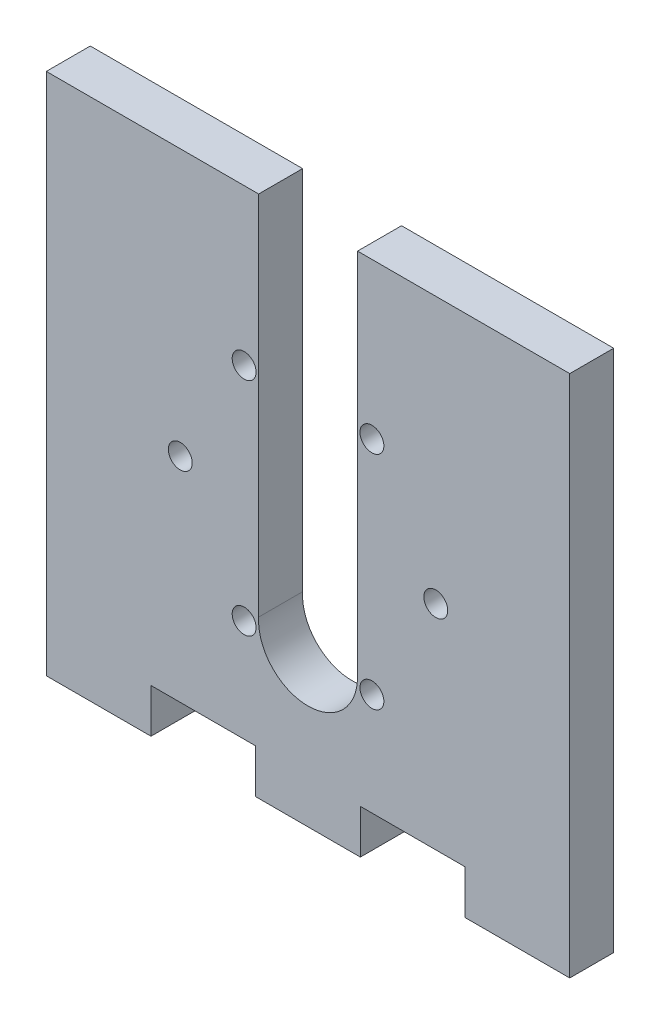
ISO-10303-21;
HEADER;
FILE_DESCRIPTION(('STEP AP214'),'2;1');
FILE_NAME('part.step','',(''),(''),'','','');
FILE_SCHEMA(('AUTOMOTIVE_DESIGN { 1 0 10303 214 1 1 1 1 }'));
ENDSEC;
DATA;
#1=APPLICATION_CONTEXT('core data for automotive mechanical design processes');
#2=APPLICATION_PROTOCOL_DEFINITION('international standard','automotive_design',2000,#1);
#3=PRODUCT_CONTEXT('',#1,'mechanical');
#4=PRODUCT('Part','Part','',(#3));
#5=PRODUCT_RELATED_PRODUCT_CATEGORY('part','',(#4));
#6=PRODUCT_DEFINITION_FORMATION('','',#4);
#7=PRODUCT_DEFINITION_CONTEXT('part definition',#1,'design');
#8=PRODUCT_DEFINITION('design','',#6,#7);
#9=PRODUCT_DEFINITION_SHAPE('','',#8);
#10=(LENGTH_UNIT() NAMED_UNIT(*) SI_UNIT(.MILLI.,.METRE.));
#11=(NAMED_UNIT(*) PLANE_ANGLE_UNIT() SI_UNIT($,.RADIAN.));
#12=(NAMED_UNIT(*) SI_UNIT($,.STERADIAN.) SOLID_ANGLE_UNIT());
#13=UNCERTAINTY_MEASURE_WITH_UNIT(LENGTH_MEASURE(1.E-05),#10,'distance_accuracy_value','');
#14=(GEOMETRIC_REPRESENTATION_CONTEXT(3) GLOBAL_UNCERTAINTY_ASSIGNED_CONTEXT((#13)) GLOBAL_UNIT_ASSIGNED_CONTEXT((#10,
#11,#12)) REPRESENTATION_CONTEXT('',''));
#15=CARTESIAN_POINT('',(0.,0.,0.));
#16=DIRECTION('',(0.,0.,1.));
#17=DIRECTION('',(1.,0.,0.));
#18=AXIS2_PLACEMENT_3D('',#15,#16,#17);
#19=CARTESIAN_POINT('',(0.,63.5,5.334));
#20=DIRECTION('',(0.,-1.,0.));
#21=DIRECTION('',(0.,0.,-1.));
#22=AXIS2_PLACEMENT_3D('',#19,#20,#21);
#23=PLANE('',#22);
#24=DIRECTION('',(-1.,0.,0.));
#25=VECTOR('',#24,1.);
#26=CARTESIAN_POINT('',(0.,63.5,5.334));
#27=LINE('',#26,#25);
#28=CARTESIAN_POINT('',(25.7601824199655,63.5,5.334));
#29=VERTEX_POINT('',#28);
#30=CARTESIAN_POINT('',(0.,63.5,5.334));
#31=VERTEX_POINT('',#30);
#32=EDGE_CURVE('E251',#29,#31,#27,.T.);
#33=ORIENTED_EDGE('',*,*,#32,.F.);
#34=DIRECTION('',(0.,0.,1.));
#35=VECTOR('',#34,1.);
#36=CARTESIAN_POINT('',(25.7601824199655,63.5,0.));
#37=LINE('',#36,#35);
#38=CARTESIAN_POINT('',(25.7601824199655,63.5,0.));
#39=VERTEX_POINT('',#38);
#40=EDGE_CURVE('E186',#39,#29,#37,.T.);
#41=ORIENTED_EDGE('',*,*,#40,.F.);
#42=DIRECTION('',(-1.,0.,0.));
#43=VECTOR('',#42,1.);
#44=CARTESIAN_POINT('',(0.,63.5,0.));
#45=LINE('',#44,#43);
#46=CARTESIAN_POINT('',(0.,63.5,0.));
#47=VERTEX_POINT('',#46);
#48=EDGE_CURVE('E177',#39,#47,#45,.T.);
#49=ORIENTED_EDGE('',*,*,#48,.T.);
#50=DIRECTION('',(0.,0.,-1.));
#51=VECTOR('',#50,1.);
#52=CARTESIAN_POINT('',(0.,63.5,5.334));
#53=LINE('',#52,#51);
#54=EDGE_CURVE('E255',#31,#47,#53,.T.);
#55=ORIENTED_EDGE('',*,*,#54,.F.);
#56=EDGE_LOOP('',(#33,#41,#49,#55));
#57=FACE_BOUND('',#56,.T.);
#58=ADVANCED_FACE('F44',(#57),#23,.F.);
#59=CARTESIAN_POINT('',(0.,0.,5.334));
#60=DIRECTION('',(0.,1.,0.));
#61=DIRECTION('',(0.,0.,1.));
#62=AXIS2_PLACEMENT_3D('',#59,#60,#61);
#63=PLANE('',#62);
#64=DIRECTION('',(1.,0.,0.));
#65=VECTOR('',#64,1.);
#66=CARTESIAN_POINT('',(0.,0.,0.));
#67=LINE('',#66,#65);
#68=CARTESIAN_POINT('',(0.,0.,0.));
#69=VERTEX_POINT('',#68);
#70=CARTESIAN_POINT('',(12.7,0.,0.));
#71=VERTEX_POINT('',#70);
#72=EDGE_CURVE('E259',#69,#71,#67,.T.);
#73=ORIENTED_EDGE('',*,*,#72,.T.);
#74=DIRECTION('',(0.,0.,1.));
#75=VECTOR('',#74,1.);
#76=CARTESIAN_POINT('',(12.7,0.,0.));
#77=LINE('',#76,#75);
#78=CARTESIAN_POINT('',(12.7,0.,5.334));
#79=VERTEX_POINT('',#78);
#80=EDGE_CURVE('E200',#71,#79,#77,.T.);
#81=ORIENTED_EDGE('',*,*,#80,.T.);
#82=DIRECTION('',(1.,0.,0.));
#83=VECTOR('',#82,1.);
#84=CARTESIAN_POINT('',(0.,0.,5.334));
#85=LINE('',#84,#83);
#86=CARTESIAN_POINT('',(0.,0.,5.334));
#87=VERTEX_POINT('',#86);
#88=EDGE_CURVE('E245',#87,#79,#85,.T.);
#89=ORIENTED_EDGE('',*,*,#88,.F.);
#90=DIRECTION('',(0.,0.,-1.));
#91=VECTOR('',#90,1.);
#92=CARTESIAN_POINT('',(0.,0.,5.334));
#93=LINE('',#92,#91);
#94=EDGE_CURVE('E52',#87,#69,#93,.T.);
#95=ORIENTED_EDGE('',*,*,#94,.T.);
#96=EDGE_LOOP('',(#73,#81,#89,#95));
#97=FACE_BOUND('',#96,.T.);
#98=ADVANCED_FACE('F277',(#97),#63,.F.);
#99=CARTESIAN_POINT('',(25.4,0.,5.334));
#100=VERTEX_POINT('',#99);
#101=CARTESIAN_POINT('',(38.1,0.,5.334));
#102=VERTEX_POINT('',#101);
#103=EDGE_CURVE('E249',#100,#102,#85,.T.);
#104=ORIENTED_EDGE('',*,*,#103,.F.);
#105=DIRECTION('',(0.,0.,1.));
#106=VECTOR('',#105,1.);
#107=CARTESIAN_POINT('',(25.4,0.,0.));
#108=LINE('',#107,#106);
#109=CARTESIAN_POINT('',(25.4,0.,0.));
#110=VERTEX_POINT('',#109);
#111=EDGE_CURVE('E214',#110,#100,#108,.T.);
#112=ORIENTED_EDGE('',*,*,#111,.F.);
#113=CARTESIAN_POINT('',(38.1,0.,0.));
#114=VERTEX_POINT('',#113);
#115=EDGE_CURVE('E263',#110,#114,#67,.T.);
#116=ORIENTED_EDGE('',*,*,#115,.T.);
#117=DIRECTION('',(0.,0.,1.));
#118=VECTOR('',#117,1.);
#119=CARTESIAN_POINT('',(38.1,0.,0.));
#120=LINE('',#119,#118);
#121=EDGE_CURVE('E227',#114,#102,#120,.T.);
#122=ORIENTED_EDGE('',*,*,#121,.T.);
#123=EDGE_LOOP('',(#104,#112,#116,#122));
#124=FACE_BOUND('',#123,.T.);
#125=ADVANCED_FACE('F390',(#124),#63,.F.);
#126=CARTESIAN_POINT('',(0.,0.,5.334));
#127=DIRECTION('',(1.,0.,0.));
#128=DIRECTION('',(0.,0.,-1.));
#129=AXIS2_PLACEMENT_3D('',#126,#127,#128);
#130=PLANE('',#129);
#131=DIRECTION('',(0.,-1.,0.));
#132=VECTOR('',#131,1.);
#133=CARTESIAN_POINT('',(0.,0.,0.));
#134=LINE('',#133,#132);
#135=EDGE_CURVE('E211',#47,#69,#134,.T.);
#136=ORIENTED_EDGE('',*,*,#135,.T.);
#137=ORIENTED_EDGE('',*,*,#94,.F.);
#138=DIRECTION('',(0.,-1.,0.));
#139=VECTOR('',#138,1.);
#140=CARTESIAN_POINT('',(0.,0.,5.334));
#141=LINE('',#140,#139);
#142=EDGE_CURVE('E240',#31,#87,#141,.T.);
#143=ORIENTED_EDGE('',*,*,#142,.F.);
#144=ORIENTED_EDGE('',*,*,#54,.T.);
#145=EDGE_LOOP('',(#136,#137,#143,#144));
#146=FACE_BOUND('',#145,.T.);
#147=ADVANCED_FACE('F46',(#146),#130,.F.);
#148=CARTESIAN_POINT('',(50.8,0.,5.334));
#149=VERTEX_POINT('',#148);
#150=CARTESIAN_POINT('',(63.5,0.,5.334));
#151=VERTEX_POINT('',#150);
#152=EDGE_CURVE('E243',#149,#151,#85,.T.);
#153=ORIENTED_EDGE('',*,*,#152,.F.);
#154=DIRECTION('',(0.,0.,1.));
#155=VECTOR('',#154,1.);
#156=CARTESIAN_POINT('',(50.8,0.,0.));
#157=LINE('',#156,#155);
#158=CARTESIAN_POINT('',(50.8,0.,0.));
#159=VERTEX_POINT('',#158);
#160=EDGE_CURVE('E236',#159,#149,#157,.T.);
#161=ORIENTED_EDGE('',*,*,#160,.F.);
#162=CARTESIAN_POINT('',(63.5,0.,0.));
#163=VERTEX_POINT('',#162);
#164=EDGE_CURVE('E258',#159,#163,#67,.T.);
#165=ORIENTED_EDGE('',*,*,#164,.T.);
#166=DIRECTION('',(0.,0.,-1.));
#167=VECTOR('',#166,1.);
#168=CARTESIAN_POINT('',(63.5,0.,5.334));
#169=LINE('',#168,#167);
#170=EDGE_CURVE('E272',#151,#163,#169,.T.);
#171=ORIENTED_EDGE('',*,*,#170,.F.);
#172=EDGE_LOOP('',(#153,#161,#165,#171));
#173=FACE_BOUND('',#172,.T.);
#174=ADVANCED_FACE('F391',(#173),#63,.F.);
#175=CARTESIAN_POINT('',(63.5,0.,5.334));
#176=DIRECTION('',(-1.,0.,0.));
#177=DIRECTION('',(0.,0.,1.));
#178=AXIS2_PLACEMENT_3D('',#175,#176,#177);
#179=PLANE('',#178);
#180=DIRECTION('',(0.,1.,0.));
#181=VECTOR('',#180,1.);
#182=CARTESIAN_POINT('',(63.5,0.,0.));
#183=LINE('',#182,#181);
#184=CARTESIAN_POINT('',(63.5,63.5,0.));
#185=VERTEX_POINT('',#184);
#186=EDGE_CURVE('E262',#163,#185,#183,.T.);
#187=ORIENTED_EDGE('',*,*,#186,.T.);
#188=DIRECTION('',(0.,0.,-1.));
#189=VECTOR('',#188,1.);
#190=CARTESIAN_POINT('',(63.5,63.5,5.334));
#191=LINE('',#190,#189);
#192=CARTESIAN_POINT('',(63.5,63.5,5.334));
#193=VERTEX_POINT('',#192);
#194=EDGE_CURVE('E269',#193,#185,#191,.T.);
#195=ORIENTED_EDGE('',*,*,#194,.F.);
#196=DIRECTION('',(0.,1.,0.));
#197=VECTOR('',#196,1.);
#198=CARTESIAN_POINT('',(63.5,0.,5.334));
#199=LINE('',#198,#197);
#200=EDGE_CURVE('E248',#151,#193,#199,.T.);
#201=ORIENTED_EDGE('',*,*,#200,.F.);
#202=ORIENTED_EDGE('',*,*,#170,.T.);
#203=EDGE_LOOP('',(#187,#195,#201,#202));
#204=FACE_BOUND('',#203,.T.);
#205=ADVANCED_FACE('F395',(#204),#179,.F.);
#206=CARTESIAN_POINT('',(37.7601824199655,63.5,0.));
#207=VERTEX_POINT('',#206);
#208=EDGE_CURVE('E244',#185,#207,#45,.T.);
#209=ORIENTED_EDGE('',*,*,#208,.T.);
#210=DIRECTION('',(0.,0.,1.));
#211=VECTOR('',#210,1.);
#212=CARTESIAN_POINT('',(37.7601824199655,63.5,0.));
#213=LINE('',#212,#211);
#214=CARTESIAN_POINT('',(37.7601824199655,63.5,5.334));
#215=VERTEX_POINT('',#214);
#216=EDGE_CURVE('E290',#207,#215,#213,.T.);
#217=ORIENTED_EDGE('',*,*,#216,.T.);
#218=EDGE_CURVE('E252',#193,#215,#27,.T.);
#219=ORIENTED_EDGE('',*,*,#218,.F.);
#220=ORIENTED_EDGE('',*,*,#194,.T.);
#221=EDGE_LOOP('',(#209,#217,#219,#220));
#222=FACE_BOUND('',#221,.T.);
#223=ADVANCED_FACE('F357',(#222),#23,.F.);
#224=CARTESIAN_POINT('',(0.,0.,5.334));
#225=DIRECTION('',(0.,0.,-1.));
#226=DIRECTION('',(-1.,0.,0.));
#227=AXIS2_PLACEMENT_3D('',#224,#225,#226);
#228=PLANE('',#227);
#229=CARTESIAN_POINT('',(47.25,31.1999999569999,5.334));
#230=DIRECTION('',(0.,0.,1.));
#231=DIRECTION('',(1.,0.,0.));
#232=AXIS2_PLACEMENT_3D('',#229,#230,#231);
#233=CIRCLE('',#232,1.45);
#234=CARTESIAN_POINT('',(48.7,31.1999999569999,5.334));
#235=VERTEX_POINT('',#234);
#236=EDGE_CURVE('E335',#235,#235,#233,.T.);
#237=ORIENTED_EDGE('',*,*,#236,.F.);
#238=EDGE_LOOP('',(#237));
#239=FACE_BOUND('',#238,.T.);
#240=CARTESIAN_POINT('',(39.5000000000003,44.6233937156587,5.334));
#241=DIRECTION('',(0.,0.,1.));
#242=DIRECTION('',(1.,0.,0.));
#243=AXIS2_PLACEMENT_3D('',#240,#241,#242);
#244=CIRCLE('',#243,1.45);
#245=CARTESIAN_POINT('',(40.9500000000003,44.6233937156587,5.334));
#246=VERTEX_POINT('',#245);
#247=EDGE_CURVE('E336',#246,#246,#244,.T.);
#248=ORIENTED_EDGE('',*,*,#247,.F.);
#249=EDGE_LOOP('',(#248));
#250=FACE_BOUND('',#249,.T.);
#251=CARTESIAN_POINT('',(24.0000000000003,44.6233937156589,5.334));
#252=DIRECTION('',(0.,0.,1.));
#253=DIRECTION('',(1.,0.,0.));
#254=AXIS2_PLACEMENT_3D('',#251,#252,#253);
#255=CIRCLE('',#254,1.45);
#256=CARTESIAN_POINT('',(25.4500000000003,44.6233937156589,5.334));
#257=VERTEX_POINT('',#256);
#258=EDGE_CURVE('E310',#257,#257,#255,.T.);
#259=ORIENTED_EDGE('',*,*,#258,.F.);
#260=EDGE_LOOP('',(#259));
#261=FACE_BOUND('',#260,.T.);
#262=CARTESIAN_POINT('',(16.25,31.1999999570002,5.334));
#263=DIRECTION('',(0.,0.,1.));
#264=DIRECTION('',(1.,0.,0.));
#265=AXIS2_PLACEMENT_3D('',#262,#263,#264);
#266=CIRCLE('',#265,1.45);
#267=CARTESIAN_POINT('',(17.7,31.1999999570002,5.334));
#268=VERTEX_POINT('',#267);
#269=EDGE_CURVE('E317',#268,#268,#266,.T.);
#270=ORIENTED_EDGE('',*,*,#269,.F.);
#271=EDGE_LOOP('',(#270));
#272=FACE_BOUND('',#271,.T.);
#273=CARTESIAN_POINT('',(23.9999999999999,17.7766061983413,5.334));
#274=DIRECTION('',(0.,0.,1.));
#275=DIRECTION('',(1.,0.,0.));
#276=AXIS2_PLACEMENT_3D('',#273,#274,#275);
#277=CIRCLE('',#276,1.45);
#278=CARTESIAN_POINT('',(25.4499999999999,17.7766061983413,5.334));
#279=VERTEX_POINT('',#278);
#280=EDGE_CURVE('E323',#279,#279,#277,.T.);
#281=ORIENTED_EDGE('',*,*,#280,.F.);
#282=EDGE_LOOP('',(#281));
#283=FACE_BOUND('',#282,.T.);
#284=CARTESIAN_POINT('',(39.4999999999999,17.7766061983411,5.334));
#285=DIRECTION('',(0.,0.,1.));
#286=DIRECTION('',(1.,0.,0.));
#287=AXIS2_PLACEMENT_3D('',#284,#285,#286);
#288=CIRCLE('',#287,1.45);
#289=CARTESIAN_POINT('',(40.9499999999999,17.7766061983411,5.334));
#290=VERTEX_POINT('',#289);
#291=EDGE_CURVE('E329',#290,#290,#288,.T.);
#292=ORIENTED_EDGE('',*,*,#291,.F.);
#293=EDGE_LOOP('',(#292));
#294=FACE_BOUND('',#293,.T.);
#295=CARTESIAN_POINT('',(31.75,18.699999938,5.334));
#296=DIRECTION('',(0.,0.,1.));
#297=DIRECTION('',(1.,0.,0.));
#298=AXIS2_PLACEMENT_3D('',#295,#296,#297);
#299=CIRCLE('',#298,5.99999993800001);
#300=CARTESIAN_POINT('',(25.7601824199655,19.0494060253968,5.334));
#301=VERTEX_POINT('',#300);
#302=CARTESIAN_POINT('',(37.7398175800345,19.0494060253968,5.334));
#303=VERTEX_POINT('',#302);
#304=EDGE_CURVE('E182',#301,#303,#299,.T.);
#305=ORIENTED_EDGE('',*,*,#304,.F.);
#306=DIRECTION('',(0.,-1.,0.));
#307=VECTOR('',#306,1.);
#308=CARTESIAN_POINT('',(25.7601824199655,19.0494060253968,5.334));
#309=LINE('',#308,#307);
#310=EDGE_CURVE('E59',#29,#301,#309,.T.);
#311=ORIENTED_EDGE('',*,*,#310,.F.);
#312=ORIENTED_EDGE('',*,*,#32,.T.);
#313=ORIENTED_EDGE('',*,*,#142,.T.);
#314=ORIENTED_EDGE('',*,*,#88,.T.);
#315=DIRECTION('',(0.,-1.,0.));
#316=VECTOR('',#315,1.);
#317=CARTESIAN_POINT('',(12.7,0.,5.334));
#318=LINE('',#317,#316);
#319=CARTESIAN_POINT('',(12.7,5.334,5.334));
#320=VERTEX_POINT('',#319);
#321=EDGE_CURVE('E201',#320,#79,#318,.T.);
#322=ORIENTED_EDGE('',*,*,#321,.F.);
#323=DIRECTION('',(-1.,0.,0.));
#324=VECTOR('',#323,1.);
#325=CARTESIAN_POINT('',(12.7,5.334,5.334));
#326=LINE('',#325,#324);
#327=CARTESIAN_POINT('',(25.4,5.334,5.334));
#328=VERTEX_POINT('',#327);
#329=EDGE_CURVE('E194',#328,#320,#326,.T.);
#330=ORIENTED_EDGE('',*,*,#329,.F.);
#331=DIRECTION('',(0.,1.,0.));
#332=VECTOR('',#331,1.);
#333=CARTESIAN_POINT('',(25.4,0.,5.334));
#334=LINE('',#333,#332);
#335=EDGE_CURVE('E203',#100,#328,#334,.T.);
#336=ORIENTED_EDGE('',*,*,#335,.F.);
#337=ORIENTED_EDGE('',*,*,#103,.T.);
#338=DIRECTION('',(0.,-1.,0.));
#339=VECTOR('',#338,1.);
#340=CARTESIAN_POINT('',(38.1,0.,5.334));
#341=LINE('',#340,#339);
#342=CARTESIAN_POINT('',(38.1,5.334,5.334));
#343=VERTEX_POINT('',#342);
#344=EDGE_CURVE('E181',#343,#102,#341,.T.);
#345=ORIENTED_EDGE('',*,*,#344,.F.);
#346=DIRECTION('',(-1.,0.,0.));
#347=VECTOR('',#346,1.);
#348=CARTESIAN_POINT('',(38.1,5.334,5.334));
#349=LINE('',#348,#347);
#350=CARTESIAN_POINT('',(50.8,5.334,5.334));
#351=VERTEX_POINT('',#350);
#352=EDGE_CURVE('E222',#351,#343,#349,.T.);
#353=ORIENTED_EDGE('',*,*,#352,.F.);
#354=DIRECTION('',(0.,1.,0.));
#355=VECTOR('',#354,1.);
#356=CARTESIAN_POINT('',(50.8,0.,5.334));
#357=LINE('',#356,#355);
#358=EDGE_CURVE('E184',#149,#351,#357,.T.);
#359=ORIENTED_EDGE('',*,*,#358,.F.);
#360=ORIENTED_EDGE('',*,*,#152,.T.);
#361=ORIENTED_EDGE('',*,*,#200,.T.);
#362=ORIENTED_EDGE('',*,*,#218,.T.);
#363=DIRECTION('',(0.,1.,0.));
#364=VECTOR('',#363,1.);
#365=CARTESIAN_POINT('',(37.7601824199655,19.0494060253968,5.334));
#366=LINE('',#365,#364);
#367=CARTESIAN_POINT('',(37.7601824199655,19.0494060253968,5.334));
#368=VERTEX_POINT('',#367);
#369=EDGE_CURVE('E178',#368,#215,#366,.T.);
#370=ORIENTED_EDGE('',*,*,#369,.F.);
#371=DIRECTION('',(1.,0.,0.));
#372=VECTOR('',#371,1.);
#373=CARTESIAN_POINT('',(25.7601824199655,19.0494060253968,5.334));
#374=LINE('',#373,#372);
#375=EDGE_CURVE('E303',#303,#368,#374,.T.);
#376=ORIENTED_EDGE('',*,*,#375,.F.);
#377=EDGE_LOOP('',(#305,#311,#312,#313,#314,#322,#330,#336,#337,#345,#353,#359,#360,#361,#362,
#370,#376));
#378=FACE_BOUND('',#377,.T.);
#379=ADVANCED_FACE('F286',(#239,#250,#261,#272,#283,#294,#378),#228,.F.);
#380=CARTESIAN_POINT('',(0.,0.,0.));
#381=DIRECTION('',(0.,0.,-1.));
#382=DIRECTION('',(-1.,0.,0.));
#383=AXIS2_PLACEMENT_3D('',#380,#381,#382);
#384=PLANE('',#383);
#385=CARTESIAN_POINT('',(47.25,31.1999999569999,0.));
#386=DIRECTION('',(0.,0.,1.));
#387=DIRECTION('',(1.,0.,0.));
#388=AXIS2_PLACEMENT_3D('',#385,#386,#387);
#389=CIRCLE('',#388,1.45);
#390=CARTESIAN_POINT('',(48.7,31.1999999569999,0.));
#391=VERTEX_POINT('',#390);
#392=EDGE_CURVE('E305',#391,#391,#389,.T.);
#393=ORIENTED_EDGE('',*,*,#392,.T.);
#394=EDGE_LOOP('',(#393));
#395=FACE_BOUND('',#394,.T.);
#396=CARTESIAN_POINT('',(39.5000000000003,44.6233937156587,0.));
#397=DIRECTION('',(0.,0.,1.));
#398=DIRECTION('',(1.,0.,0.));
#399=AXIS2_PLACEMENT_3D('',#396,#397,#398);
#400=CIRCLE('',#399,1.45);
#401=CARTESIAN_POINT('',(40.9500000000003,44.6233937156587,0.));
#402=VERTEX_POINT('',#401);
#403=EDGE_CURVE('E314',#402,#402,#400,.T.);
#404=ORIENTED_EDGE('',*,*,#403,.T.);
#405=EDGE_LOOP('',(#404));
#406=FACE_BOUND('',#405,.T.);
#407=CARTESIAN_POINT('',(24.0000000000003,44.6233937156589,0.));
#408=DIRECTION('',(0.,0.,1.));
#409=DIRECTION('',(1.,0.,0.));
#410=AXIS2_PLACEMENT_3D('',#407,#408,#409);
#411=CIRCLE('',#410,1.45);
#412=CARTESIAN_POINT('',(25.4500000000003,44.6233937156589,0.));
#413=VERTEX_POINT('',#412);
#414=EDGE_CURVE('E313',#413,#413,#411,.T.);
#415=ORIENTED_EDGE('',*,*,#414,.T.);
#416=EDGE_LOOP('',(#415));
#417=FACE_BOUND('',#416,.T.);
#418=CARTESIAN_POINT('',(16.25,31.1999999570002,0.));
#419=DIRECTION('',(0.,0.,1.));
#420=DIRECTION('',(1.,0.,0.));
#421=AXIS2_PLACEMENT_3D('',#418,#419,#420);
#422=CIRCLE('',#421,1.45);
#423=CARTESIAN_POINT('',(17.7,31.1999999570002,0.));
#424=VERTEX_POINT('',#423);
#425=EDGE_CURVE('E320',#424,#424,#422,.T.);
#426=ORIENTED_EDGE('',*,*,#425,.T.);
#427=EDGE_LOOP('',(#426));
#428=FACE_BOUND('',#427,.T.);
#429=CARTESIAN_POINT('',(23.9999999999999,17.7766061983413,0.));
#430=DIRECTION('',(0.,0.,1.));
#431=DIRECTION('',(1.,0.,0.));
#432=AXIS2_PLACEMENT_3D('',#429,#430,#431);
#433=CIRCLE('',#432,1.45);
#434=CARTESIAN_POINT('',(25.4499999999999,17.7766061983413,0.));
#435=VERTEX_POINT('',#434);
#436=EDGE_CURVE('E326',#435,#435,#433,.T.);
#437=ORIENTED_EDGE('',*,*,#436,.T.);
#438=EDGE_LOOP('',(#437));
#439=FACE_BOUND('',#438,.T.);
#440=CARTESIAN_POINT('',(39.4999999999999,17.7766061983411,0.));
#441=DIRECTION('',(0.,0.,1.));
#442=DIRECTION('',(1.,0.,0.));
#443=AXIS2_PLACEMENT_3D('',#440,#441,#442);
#444=CIRCLE('',#443,1.45);
#445=CARTESIAN_POINT('',(40.9499999999999,17.7766061983411,0.));
#446=VERTEX_POINT('',#445);
#447=EDGE_CURVE('E332',#446,#446,#444,.T.);
#448=ORIENTED_EDGE('',*,*,#447,.T.);
#449=EDGE_LOOP('',(#448));
#450=FACE_BOUND('',#449,.T.);
#451=DIRECTION('',(0.,-1.,0.));
#452=VECTOR('',#451,1.);
#453=CARTESIAN_POINT('',(25.7601824199655,19.0494060253968,0.));
#454=LINE('',#453,#452);
#455=CARTESIAN_POINT('',(25.7601824199655,19.0494060253968,0.));
#456=VERTEX_POINT('',#455);
#457=EDGE_CURVE('E162',#39,#456,#454,.T.);
#458=ORIENTED_EDGE('',*,*,#457,.T.);
#459=CARTESIAN_POINT('',(31.75,18.699999938,0.));
#460=DIRECTION('',(0.,0.,1.));
#461=DIRECTION('',(1.,0.,0.));
#462=AXIS2_PLACEMENT_3D('',#459,#460,#461);
#463=CIRCLE('',#462,5.99999993800001);
#464=CARTESIAN_POINT('',(37.7398175800345,19.0494060253968,0.));
#465=VERTEX_POINT('',#464);
#466=EDGE_CURVE('E175',#456,#465,#463,.T.);
#467=ORIENTED_EDGE('',*,*,#466,.T.);
#468=DIRECTION('',(1.,0.,0.));
#469=VECTOR('',#468,1.);
#470=CARTESIAN_POINT('',(25.7601824199655,19.0494060253968,0.));
#471=LINE('',#470,#469);
#472=CARTESIAN_POINT('',(37.7601824199655,19.0494060253968,0.));
#473=VERTEX_POINT('',#472);
#474=EDGE_CURVE('E67',#465,#473,#471,.T.);
#475=ORIENTED_EDGE('',*,*,#474,.T.);
#476=DIRECTION('',(0.,1.,0.));
#477=VECTOR('',#476,1.);
#478=CARTESIAN_POINT('',(37.7601824199655,19.0494060253968,0.));
#479=LINE('',#478,#477);
#480=EDGE_CURVE('E169',#473,#207,#479,.T.);
#481=ORIENTED_EDGE('',*,*,#480,.T.);
#482=ORIENTED_EDGE('',*,*,#208,.F.);
#483=ORIENTED_EDGE('',*,*,#186,.F.);
#484=ORIENTED_EDGE('',*,*,#164,.F.);
#485=DIRECTION('',(0.,1.,0.));
#486=VECTOR('',#485,1.);
#487=CARTESIAN_POINT('',(50.8,0.,0.));
#488=LINE('',#487,#486);
#489=CARTESIAN_POINT('',(50.8,5.334,0.));
#490=VERTEX_POINT('',#489);
#491=EDGE_CURVE('E221',#159,#490,#488,.T.);
#492=ORIENTED_EDGE('',*,*,#491,.T.);
#493=DIRECTION('',(-1.,0.,0.));
#494=VECTOR('',#493,1.);
#495=CARTESIAN_POINT('',(38.1,5.334,0.));
#496=LINE('',#495,#494);
#497=CARTESIAN_POINT('',(38.1,5.334,0.));
#498=VERTEX_POINT('',#497);
#499=EDGE_CURVE('E225',#490,#498,#496,.T.);
#500=ORIENTED_EDGE('',*,*,#499,.T.);
#501=DIRECTION('',(0.,-1.,0.));
#502=VECTOR('',#501,1.);
#503=CARTESIAN_POINT('',(38.1,0.,0.));
#504=LINE('',#503,#502);
#505=EDGE_CURVE('E218',#498,#114,#504,.T.);
#506=ORIENTED_EDGE('',*,*,#505,.T.);
#507=ORIENTED_EDGE('',*,*,#115,.F.);
#508=DIRECTION('',(0.,1.,0.));
#509=VECTOR('',#508,1.);
#510=CARTESIAN_POINT('',(25.4,0.,0.));
#511=LINE('',#510,#509);
#512=CARTESIAN_POINT('',(25.4,5.334,0.));
#513=VERTEX_POINT('',#512);
#514=EDGE_CURVE('E193',#110,#513,#511,.T.);
#515=ORIENTED_EDGE('',*,*,#514,.T.);
#516=DIRECTION('',(-1.,0.,0.));
#517=VECTOR('',#516,1.);
#518=CARTESIAN_POINT('',(12.7,5.334,0.));
#519=LINE('',#518,#517);
#520=CARTESIAN_POINT('',(12.7,5.334,0.));
#521=VERTEX_POINT('',#520);
#522=EDGE_CURVE('E197',#513,#521,#519,.T.);
#523=ORIENTED_EDGE('',*,*,#522,.T.);
#524=DIRECTION('',(0.,-1.,0.));
#525=VECTOR('',#524,1.);
#526=CARTESIAN_POINT('',(12.7,0.,0.));
#527=LINE('',#526,#525);
#528=EDGE_CURVE('E190',#521,#71,#527,.T.);
#529=ORIENTED_EDGE('',*,*,#528,.T.);
#530=ORIENTED_EDGE('',*,*,#72,.F.);
#531=ORIENTED_EDGE('',*,*,#135,.F.);
#532=ORIENTED_EDGE('',*,*,#48,.F.);
#533=EDGE_LOOP('',(#458,#467,#475,#481,#482,#483,#484,#492,#500,#506,#507,#515,#523,#529,#530,
#531,#532));
#534=FACE_BOUND('',#533,.T.);
#535=ADVANCED_FACE('F174',(#395,#406,#417,#428,#439,#450,#534),#384,.T.);
#536=CARTESIAN_POINT('',(38.1,0.,0.));
#537=DIRECTION('',(-1.,0.,0.));
#538=DIRECTION('',(0.,0.,1.));
#539=AXIS2_PLACEMENT_3D('',#536,#537,#538);
#540=PLANE('',#539);
#541=ORIENTED_EDGE('',*,*,#344,.T.);
#542=ORIENTED_EDGE('',*,*,#121,.F.);
#543=ORIENTED_EDGE('',*,*,#505,.F.);
#544=DIRECTION('',(0.,0.,1.));
#545=VECTOR('',#544,1.);
#546=CARTESIAN_POINT('',(38.1,5.334,0.));
#547=LINE('',#546,#545);
#548=EDGE_CURVE('E204',#498,#343,#547,.T.);
#549=ORIENTED_EDGE('',*,*,#548,.T.);
#550=EDGE_LOOP('',(#541,#542,#543,#549));
#551=FACE_BOUND('',#550,.T.);
#552=ADVANCED_FACE('F418',(#551),#540,.F.);
#553=CARTESIAN_POINT('',(38.1,5.334,0.));
#554=DIRECTION('',(0.,1.,0.));
#555=DIRECTION('',(0.,0.,1.));
#556=AXIS2_PLACEMENT_3D('',#553,#554,#555);
#557=PLANE('',#556);
#558=ORIENTED_EDGE('',*,*,#352,.T.);
#559=ORIENTED_EDGE('',*,*,#548,.F.);
#560=ORIENTED_EDGE('',*,*,#499,.F.);
#561=DIRECTION('',(0.,0.,1.));
#562=VECTOR('',#561,1.);
#563=CARTESIAN_POINT('',(50.8,5.334,0.));
#564=LINE('',#563,#562);
#565=EDGE_CURVE('E234',#490,#351,#564,.T.);
#566=ORIENTED_EDGE('',*,*,#565,.T.);
#567=EDGE_LOOP('',(#558,#559,#560,#566));
#568=FACE_BOUND('',#567,.T.);
#569=ADVANCED_FACE('F427',(#568),#557,.F.);
#570=CARTESIAN_POINT('',(50.8,0.,0.));
#571=DIRECTION('',(1.,0.,0.));
#572=DIRECTION('',(0.,0.,-1.));
#573=AXIS2_PLACEMENT_3D('',#570,#571,#572);
#574=PLANE('',#573);
#575=ORIENTED_EDGE('',*,*,#358,.T.);
#576=ORIENTED_EDGE('',*,*,#565,.F.);
#577=ORIENTED_EDGE('',*,*,#491,.F.);
#578=ORIENTED_EDGE('',*,*,#160,.T.);
#579=EDGE_LOOP('',(#575,#576,#577,#578));
#580=FACE_BOUND('',#579,.T.);
#581=ADVANCED_FACE('F425',(#580),#574,.F.);
#582=CARTESIAN_POINT('',(12.7,0.,0.));
#583=DIRECTION('',(-1.,0.,0.));
#584=DIRECTION('',(0.,0.,1.));
#585=AXIS2_PLACEMENT_3D('',#582,#583,#584);
#586=PLANE('',#585);
#587=ORIENTED_EDGE('',*,*,#321,.T.);
#588=ORIENTED_EDGE('',*,*,#80,.F.);
#589=ORIENTED_EDGE('',*,*,#528,.F.);
#590=DIRECTION('',(0.,0.,1.));
#591=VECTOR('',#590,1.);
#592=CARTESIAN_POINT('',(12.7,5.334,0.));
#593=LINE('',#592,#591);
#594=EDGE_CURVE('E209',#521,#320,#593,.T.);
#595=ORIENTED_EDGE('',*,*,#594,.T.);
#596=EDGE_LOOP('',(#587,#588,#589,#595));
#597=FACE_BOUND('',#596,.T.);
#598=ADVANCED_FACE('F283',(#597),#586,.F.);
#599=CARTESIAN_POINT('',(12.7,5.334,0.));
#600=DIRECTION('',(0.,1.,0.));
#601=DIRECTION('',(0.,0.,1.));
#602=AXIS2_PLACEMENT_3D('',#599,#600,#601);
#603=PLANE('',#602);
#604=ORIENTED_EDGE('',*,*,#329,.T.);
#605=ORIENTED_EDGE('',*,*,#594,.F.);
#606=ORIENTED_EDGE('',*,*,#522,.F.);
#607=DIRECTION('',(0.,0.,1.));
#608=VECTOR('',#607,1.);
#609=CARTESIAN_POINT('',(25.4,5.334,0.));
#610=LINE('',#609,#608);
#611=EDGE_CURVE('E212',#513,#328,#610,.T.);
#612=ORIENTED_EDGE('',*,*,#611,.T.);
#613=EDGE_LOOP('',(#604,#605,#606,#612));
#614=FACE_BOUND('',#613,.T.);
#615=ADVANCED_FACE('F472',(#614),#603,.F.);
#616=CARTESIAN_POINT('',(25.4,0.,0.));
#617=DIRECTION('',(1.,0.,0.));
#618=DIRECTION('',(0.,0.,-1.));
#619=AXIS2_PLACEMENT_3D('',#616,#617,#618);
#620=PLANE('',#619);
#621=ORIENTED_EDGE('',*,*,#335,.T.);
#622=ORIENTED_EDGE('',*,*,#611,.F.);
#623=ORIENTED_EDGE('',*,*,#514,.F.);
#624=ORIENTED_EDGE('',*,*,#111,.T.);
#625=EDGE_LOOP('',(#621,#622,#623,#624));
#626=FACE_BOUND('',#625,.T.);
#627=ADVANCED_FACE('F480',(#626),#620,.F.);
#628=CARTESIAN_POINT('',(31.75,18.699999938,0.));
#629=DIRECTION('',(0.,0.,1.));
#630=DIRECTION('',(1.,0.,0.));
#631=AXIS2_PLACEMENT_3D('',#628,#629,#630);
#632=CYLINDRICAL_SURFACE('',#631,5.99999993800001);
#633=ORIENTED_EDGE('',*,*,#304,.T.);
#634=DIRECTION('',(0.,0.,1.));
#635=VECTOR('',#634,1.);
#636=CARTESIAN_POINT('',(37.7398175800345,19.0494060253968,0.));
#637=LINE('',#636,#635);
#638=EDGE_CURVE('E13',#303,#465,#637,.F.);
#639=ORIENTED_EDGE('',*,*,#638,.T.);
#640=ORIENTED_EDGE('',*,*,#466,.F.);
#641=DIRECTION('',(0.,0.,1.));
#642=VECTOR('',#641,1.);
#643=CARTESIAN_POINT('',(25.7601824199655,19.0494060253968,0.));
#644=LINE('',#643,#642);
#645=EDGE_CURVE('E159',#456,#301,#644,.T.);
#646=ORIENTED_EDGE('',*,*,#645,.T.);
#647=EDGE_LOOP('',(#633,#639,#640,#646));
#648=FACE_BOUND('',#647,.T.);
#649=ADVANCED_FACE('F180',(#648),#632,.F.);
#650=CARTESIAN_POINT('',(25.7601824199655,19.0494060253968,0.));
#651=DIRECTION('',(-1.,0.,0.));
#652=DIRECTION('',(0.,0.,1.));
#653=AXIS2_PLACEMENT_3D('',#650,#651,#652);
#654=PLANE('',#653);
#655=ORIENTED_EDGE('',*,*,#310,.T.);
#656=ORIENTED_EDGE('',*,*,#645,.F.);
#657=ORIENTED_EDGE('',*,*,#457,.F.);
#658=ORIENTED_EDGE('',*,*,#40,.T.);
#659=EDGE_LOOP('',(#655,#656,#657,#658));
#660=FACE_BOUND('',#659,.T.);
#661=ADVANCED_FACE('F161',(#660),#654,.F.);
#662=CARTESIAN_POINT('',(25.7601824199655,19.0494060253968,0.));
#663=DIRECTION('',(0.,-1.,0.));
#664=DIRECTION('',(0.,0.,-1.));
#665=AXIS2_PLACEMENT_3D('',#662,#663,#664);
#666=PLANE('',#665);
#667=ORIENTED_EDGE('',*,*,#375,.T.);
#668=DIRECTION('',(0.,0.,1.));
#669=VECTOR('',#668,1.);
#670=CARTESIAN_POINT('',(37.7601824199655,19.0494060253968,0.));
#671=LINE('',#670,#669);
#672=EDGE_CURVE('E168',#473,#368,#671,.T.);
#673=ORIENTED_EDGE('',*,*,#672,.F.);
#674=ORIENTED_EDGE('',*,*,#474,.F.);
#675=ORIENTED_EDGE('',*,*,#638,.F.);
#676=EDGE_LOOP('',(#667,#673,#674,#675));
#677=FACE_BOUND('',#676,.T.);
#678=ADVANCED_FACE('F381',(#677),#666,.F.);
#679=CARTESIAN_POINT('',(37.7601824199655,19.0494060253968,0.));
#680=DIRECTION('',(1.,0.,0.));
#681=DIRECTION('',(0.,0.,-1.));
#682=AXIS2_PLACEMENT_3D('',#679,#680,#681);
#683=PLANE('',#682);
#684=ORIENTED_EDGE('',*,*,#369,.T.);
#685=ORIENTED_EDGE('',*,*,#216,.F.);
#686=ORIENTED_EDGE('',*,*,#480,.F.);
#687=ORIENTED_EDGE('',*,*,#672,.T.);
#688=EDGE_LOOP('',(#684,#685,#686,#687));
#689=FACE_BOUND('',#688,.T.);
#690=ADVANCED_FACE('F300',(#689),#683,.F.);
#691=CARTESIAN_POINT('',(39.4999999999999,17.7766061983411,0.));
#692=DIRECTION('',(0.,0.,1.));
#693=DIRECTION('',(1.,0.,0.));
#694=AXIS2_PLACEMENT_3D('',#691,#692,#693);
#695=CYLINDRICAL_SURFACE('',#694,1.45);
#696=ORIENTED_EDGE('',*,*,#447,.F.);
#697=EDGE_LOOP('',(#696));
#698=FACE_BOUND('',#697,.T.);
#699=ORIENTED_EDGE('',*,*,#291,.T.);
#700=EDGE_LOOP('',(#699));
#701=FACE_BOUND('',#700,.T.);
#702=ADVANCED_FACE('F369',(#698,#701),#695,.F.);
#703=CARTESIAN_POINT('',(23.9999999999999,17.7766061983413,0.));
#704=DIRECTION('',(0.,0.,1.));
#705=DIRECTION('',(1.,0.,0.));
#706=AXIS2_PLACEMENT_3D('',#703,#704,#705);
#707=CYLINDRICAL_SURFACE('',#706,1.45);
#708=ORIENTED_EDGE('',*,*,#436,.F.);
#709=EDGE_LOOP('',(#708));
#710=FACE_BOUND('',#709,.T.);
#711=ORIENTED_EDGE('',*,*,#280,.T.);
#712=EDGE_LOOP('',(#711));
#713=FACE_BOUND('',#712,.T.);
#714=ADVANCED_FACE('F371',(#710,#713),#707,.F.);
#715=CARTESIAN_POINT('',(16.25,31.1999999570002,0.));
#716=DIRECTION('',(0.,0.,1.));
#717=DIRECTION('',(1.,0.,0.));
#718=AXIS2_PLACEMENT_3D('',#715,#716,#717);
#719=CYLINDRICAL_SURFACE('',#718,1.45);
#720=ORIENTED_EDGE('',*,*,#425,.F.);
#721=EDGE_LOOP('',(#720));
#722=FACE_BOUND('',#721,.T.);
#723=ORIENTED_EDGE('',*,*,#269,.T.);
#724=EDGE_LOOP('',(#723));
#725=FACE_BOUND('',#724,.T.);
#726=ADVANCED_FACE('F378',(#722,#725),#719,.F.);
#727=CARTESIAN_POINT('',(24.0000000000003,44.6233937156589,0.));
#728=DIRECTION('',(0.,0.,1.));
#729=DIRECTION('',(1.,0.,0.));
#730=AXIS2_PLACEMENT_3D('',#727,#728,#729);
#731=CYLINDRICAL_SURFACE('',#730,1.45);
#732=ORIENTED_EDGE('',*,*,#414,.F.);
#733=EDGE_LOOP('',(#732));
#734=FACE_BOUND('',#733,.T.);
#735=ORIENTED_EDGE('',*,*,#258,.T.);
#736=EDGE_LOOP('',(#735));
#737=FACE_BOUND('',#736,.T.);
#738=ADVANCED_FACE('F579',(#734,#737),#731,.F.);
#739=CARTESIAN_POINT('',(39.5000000000003,44.6233937156587,0.));
#740=DIRECTION('',(0.,0.,1.));
#741=DIRECTION('',(1.,0.,0.));
#742=AXIS2_PLACEMENT_3D('',#739,#740,#741);
#743=CYLINDRICAL_SURFACE('',#742,1.45);
#744=ORIENTED_EDGE('',*,*,#403,.F.);
#745=EDGE_LOOP('',(#744));
#746=FACE_BOUND('',#745,.T.);
#747=ORIENTED_EDGE('',*,*,#247,.T.);
#748=EDGE_LOOP('',(#747));
#749=FACE_BOUND('',#748,.T.);
#750=ADVANCED_FACE('F351',(#746,#749),#743,.F.);
#751=CARTESIAN_POINT('',(47.25,31.1999999569999,0.));
#752=DIRECTION('',(0.,0.,1.));
#753=DIRECTION('',(1.,0.,0.));
#754=AXIS2_PLACEMENT_3D('',#751,#752,#753);
#755=CYLINDRICAL_SURFACE('',#754,1.45);
#756=ORIENTED_EDGE('',*,*,#392,.F.);
#757=EDGE_LOOP('',(#756));
#758=FACE_BOUND('',#757,.T.);
#759=ORIENTED_EDGE('',*,*,#236,.T.);
#760=EDGE_LOOP('',(#759));
#761=FACE_BOUND('',#760,.T.);
#762=ADVANCED_FACE('F348',(#758,#761),#755,.F.);
#763=CLOSED_SHELL('',(#58,#98,#125,#147,#174,#205,#223,#379,#535,#552,#569,#581,#598,#615,#627,
#649,#661,#678,#690,#702,#714,#726,#738,#750,#762));
#764=MANIFOLD_SOLID_BREP('B2',#763);
#765=ADVANCED_BREP_SHAPE_REPRESENTATION('',(#18,#764),#14);
#766=SHAPE_DEFINITION_REPRESENTATION(#9,#765);
ENDSEC;
END-ISO-10303-21;
